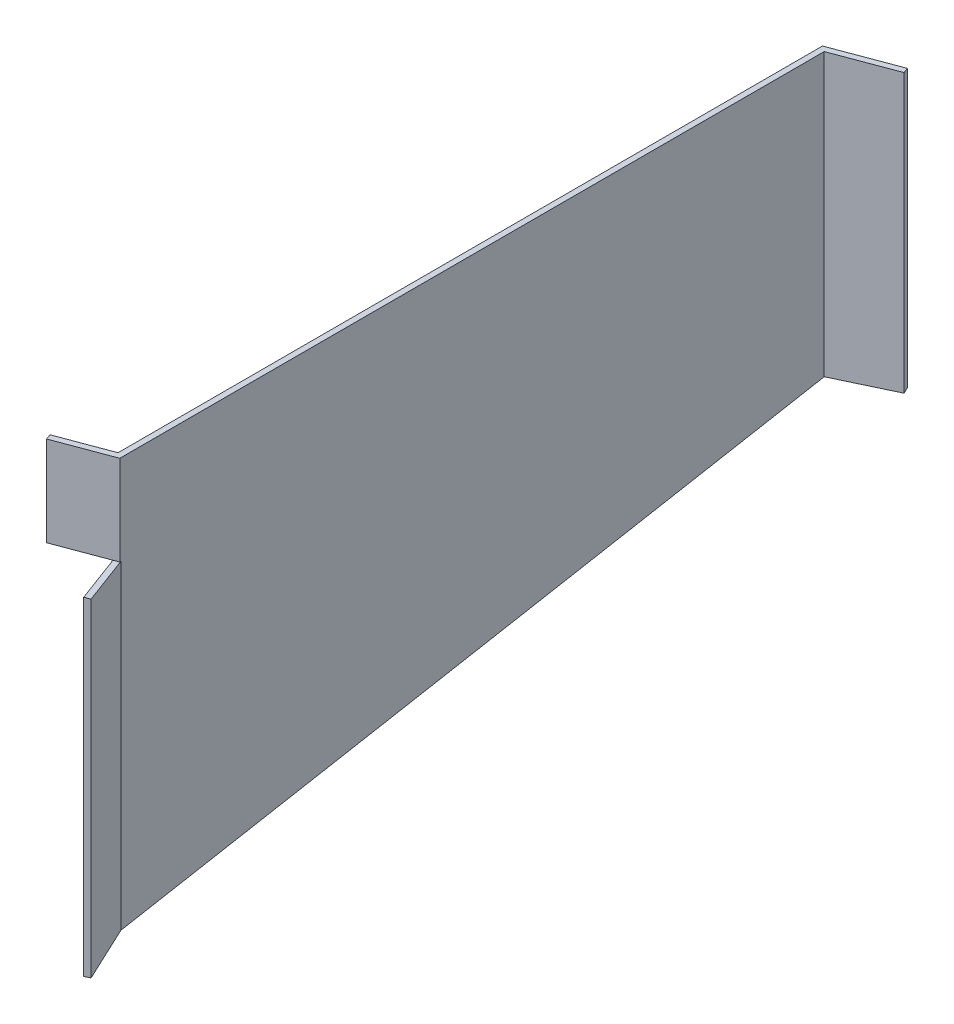
ISO-10303-21;
HEADER;
FILE_DESCRIPTION(('STEP AP214'),'2;1');
FILE_NAME('part.step','',(''),(''),'','','');
FILE_SCHEMA(('AUTOMOTIVE_DESIGN { 1 0 10303 214 1 1 1 1 }'));
ENDSEC;
DATA;
#1=APPLICATION_CONTEXT('core data for automotive mechanical design processes');
#2=APPLICATION_PROTOCOL_DEFINITION('international standard','automotive_design',2000,#1);
#3=PRODUCT_CONTEXT('',#1,'mechanical');
#4=PRODUCT('Part','Part','',(#3));
#5=PRODUCT_RELATED_PRODUCT_CATEGORY('part','',(#4));
#6=PRODUCT_DEFINITION_FORMATION('','',#4);
#7=PRODUCT_DEFINITION_CONTEXT('part definition',#1,'design');
#8=PRODUCT_DEFINITION('design','',#6,#7);
#9=PRODUCT_DEFINITION_SHAPE('','',#8);
#10=(LENGTH_UNIT() NAMED_UNIT(*) SI_UNIT(.MILLI.,.METRE.));
#11=(NAMED_UNIT(*) PLANE_ANGLE_UNIT() SI_UNIT($,.RADIAN.));
#12=(NAMED_UNIT(*) SI_UNIT($,.STERADIAN.) SOLID_ANGLE_UNIT());
#13=UNCERTAINTY_MEASURE_WITH_UNIT(LENGTH_MEASURE(1.E-05),#10,'distance_accuracy_value','');
#14=(GEOMETRIC_REPRESENTATION_CONTEXT(3) GLOBAL_UNCERTAINTY_ASSIGNED_CONTEXT((#13)) GLOBAL_UNIT_ASSIGNED_CONTEXT((#10,
#11,#12)) REPRESENTATION_CONTEXT('',''));
#15=CARTESIAN_POINT('',(0.,0.,0.));
#16=DIRECTION('',(0.,0.,1.));
#17=DIRECTION('',(1.,0.,0.));
#18=AXIS2_PLACEMENT_3D('',#15,#16,#17);
#19=CARTESIAN_POINT('',(0.,178.435,0.));
#20=DIRECTION('',(0.,-1.,0.));
#21=DIRECTION('',(0.,0.,-1.));
#22=AXIS2_PLACEMENT_3D('',#19,#20,#21);
#23=PLANE('',#22);
#24=DIRECTION('',(0.,0.,-1.));
#25=VECTOR('',#24,1.);
#26=CARTESIAN_POINT('',(0.,178.435,0.));
#27=LINE('',#26,#25);
#28=CARTESIAN_POINT('',(0.,178.435,0.));
#29=VERTEX_POINT('',#28);
#30=CARTESIAN_POINT('',(0.,178.435,-2.20339679700141));
#31=VERTEX_POINT('',#30);
#32=EDGE_CURVE('E214',#29,#31,#27,.T.);
#33=ORIENTED_EDGE('',*,*,#32,.F.);
#34=DIRECTION('',(-0.349880399655971,0.,-0.936794377617937));
#35=VECTOR('',#34,1.);
#36=CARTESIAN_POINT('',(0.,178.435,0.));
#37=LINE('',#36,#35);
#38=CARTESIAN_POINT('',(0.388671733651367,178.435,1.04065702217567));
#39=VERTEX_POINT('',#38);
#40=EDGE_CURVE('E164',#39,#29,#37,.T.);
#41=ORIENTED_EDGE('',*,*,#40,.F.);
#42=DIRECTION('',(0.936794377617936,0.,-0.349880399655973));
#43=VECTOR('',#42,1.);
#44=CARTESIAN_POINT('',(3.175,178.435,0.));
#45=LINE('',#44,#43);
#46=CARTESIAN_POINT('',(-26.5682214893695,178.435,11.1087026890771));
#47=VERTEX_POINT('',#46);
#48=EDGE_CURVE('E191',#47,#39,#45,.T.);
#49=ORIENTED_EDGE('',*,*,#48,.F.);
#50=DIRECTION('',(0.349880399655973,0.,0.936794377617936));
#51=VECTOR('',#50,1.);
#52=CARTESIAN_POINT('',(-26.5682214893695,178.435,11.1087026890771));
#53=LINE('',#52,#51);
#54=CARTESIAN_POINT('',(-27.6790917582772,178.435,8.1343805401402));
#55=VERTEX_POINT('',#54);
#56=EDGE_CURVE('E185',#55,#47,#53,.T.);
#57=ORIENTED_EDGE('',*,*,#56,.F.);
#58=DIRECTION('',(-0.936794377617936,0.,0.349880399655973));
#59=VECTOR('',#58,1.);
#60=CARTESIAN_POINT('',(-27.6790917582772,178.435,8.1343805401402));
#61=LINE('',#60,#59);
#62=EDGE_CURVE('E182',#31,#55,#61,.T.);
#63=ORIENTED_EDGE('',*,*,#62,.F.);
#64=EDGE_LOOP('',(#33,#41,#49,#57,#63));
#65=FACE_BOUND('',#64,.T.);
#66=ADVANCED_FACE('F45',(#65),#23,.T.);
#67=CARTESIAN_POINT('',(0.,228.6,0.));
#68=DIRECTION('',(1.,0.,0.));
#69=DIRECTION('',(0.,0.,-1.));
#70=AXIS2_PLACEMENT_3D('',#67,#68,#69);
#71=PLANE('',#70);
#72=ORIENTED_EDGE('',*,*,#32,.T.);
#73=DIRECTION('',(0.,1.,0.));
#74=VECTOR('',#73,1.);
#75=CARTESIAN_POINT('',(0.,228.6,-2.20339679700141));
#76=LINE('',#75,#74);
#77=CARTESIAN_POINT('',(0.,228.6,-2.20339679700139));
#78=VERTEX_POINT('',#77);
#79=EDGE_CURVE('E207',#31,#78,#76,.T.);
#80=ORIENTED_EDGE('',*,*,#79,.T.);
#81=DIRECTION('',(0.,0.,1.));
#82=VECTOR('',#81,1.);
#83=CARTESIAN_POINT('',(0.,228.6,0.));
#84=LINE('',#83,#82);
#85=CARTESIAN_POINT('',(0.,228.6,-395.409928));
#86=VERTEX_POINT('',#85);
#87=EDGE_CURVE('E255',#86,#78,#84,.T.);
#88=ORIENTED_EDGE('',*,*,#87,.F.);
#89=DIRECTION('',(0.,-1.,0.));
#90=VECTOR('',#89,1.);
#91=CARTESIAN_POINT('',(0.,228.6,-395.409928));
#92=LINE('',#91,#90);
#93=CARTESIAN_POINT('',(0.,71.795894,-395.409928));
#94=VERTEX_POINT('',#93);
#95=EDGE_CURVE('E264',#86,#94,#92,.T.);
#96=ORIENTED_EDGE('',*,*,#95,.T.);
#97=DIRECTION('',(0.,-0.178652221619614,0.983912284561168));
#98=VECTOR('',#97,1.);
#99=CARTESIAN_POINT('',(0.,0.,0.));
#100=LINE('',#99,#98);
#101=CARTESIAN_POINT('',(0.,0.,0.));
#102=VERTEX_POINT('',#101);
#103=EDGE_CURVE('E251',#94,#102,#100,.T.);
#104=ORIENTED_EDGE('',*,*,#103,.T.);
#105=DIRECTION('',(0.,-1.,0.));
#106=VECTOR('',#105,1.);
#107=CARTESIAN_POINT('',(0.,228.6,0.));
#108=LINE('',#107,#106);
#109=EDGE_CURVE('E11',#29,#102,#108,.T.);
#110=ORIENTED_EDGE('',*,*,#109,.F.);
#111=EDGE_LOOP('',(#72,#80,#88,#96,#104,#110));
#112=FACE_BOUND('',#111,.T.);
#113=ADVANCED_FACE('F47',(#112),#71,.F.);
#114=CARTESIAN_POINT('',(3.175,228.6,0.));
#115=DIRECTION('',(-1.,0.,0.));
#116=DIRECTION('',(0.,0.,1.));
#117=AXIS2_PLACEMENT_3D('',#114,#115,#116);
#118=PLANE('',#117);
#119=DIRECTION('',(0.,-1.,0.));
#120=VECTOR('',#119,1.);
#121=CARTESIAN_POINT('',(3.175,228.6,0.));
#122=LINE('',#121,#120);
#123=CARTESIAN_POINT('',(3.175,228.6,0.));
#124=VERTEX_POINT('',#123);
#125=CARTESIAN_POINT('',(3.175,178.435,0.));
#126=VERTEX_POINT('',#125);
#127=EDGE_CURVE('E54',#124,#126,#122,.T.);
#128=ORIENTED_EDGE('',*,*,#127,.T.);
#129=DIRECTION('',(0.,0.,-1.));
#130=VECTOR('',#129,1.);
#131=CARTESIAN_POINT('',(3.175,178.435,0.));
#132=LINE('',#131,#130);
#133=CARTESIAN_POINT('',(3.175,178.435,-0.573561283399627));
#134=VERTEX_POINT('',#133);
#135=EDGE_CURVE('E61',#126,#134,#132,.T.);
#136=ORIENTED_EDGE('',*,*,#135,.T.);
#137=DIRECTION('',(0.,1.,0.));
#138=VECTOR('',#137,1.);
#139=CARTESIAN_POINT('',(3.175,228.6,-0.573561283399632));
#140=LINE('',#139,#138);
#141=CARTESIAN_POINT('',(3.175,0.104143427338181,-0.57356128339963));
#142=VERTEX_POINT('',#141);
#143=EDGE_CURVE('E145',#142,#134,#140,.T.);
#144=ORIENTED_EDGE('',*,*,#143,.F.);
#145=DIRECTION('',(0.,-0.178652221619614,0.983912284561168));
#146=VECTOR('',#145,1.);
#147=CARTESIAN_POINT('',(3.175,0.,0.));
#148=LINE('',#147,#146);
#149=CARTESIAN_POINT('',(3.17500000000006,71.3958159248803,-393.206531202999));
#150=VERTEX_POINT('',#149);
#151=EDGE_CURVE('E250',#150,#142,#148,.T.);
#152=ORIENTED_EDGE('',*,*,#151,.F.);
#153=DIRECTION('',(0.,1.,0.));
#154=VECTOR('',#153,1.);
#155=CARTESIAN_POINT('',(3.17499999999993,228.6,-393.206531202999));
#156=LINE('',#155,#154);
#157=CARTESIAN_POINT('',(3.17500000000002,228.6,-393.206531202999));
#158=VERTEX_POINT('',#157);
#159=EDGE_CURVE('E246',#150,#158,#156,.T.);
#160=ORIENTED_EDGE('',*,*,#159,.T.);
#161=DIRECTION('',(0.,0.,-1.));
#162=VECTOR('',#161,1.);
#163=CARTESIAN_POINT('',(3.175,228.6,0.));
#164=LINE('',#163,#162);
#165=EDGE_CURVE('E69',#124,#158,#164,.T.);
#166=ORIENTED_EDGE('',*,*,#165,.F.);
#167=EDGE_LOOP('',(#128,#136,#144,#152,#160,#166));
#168=FACE_BOUND('',#167,.T.);
#169=ADVANCED_FACE('F270',(#168),#118,.F.);
#170=CARTESIAN_POINT('',(0.,228.6,0.));
#171=DIRECTION('',(0.,-1.,0.));
#172=DIRECTION('',(0.,0.,-1.));
#173=AXIS2_PLACEMENT_3D('',#170,#171,#172);
#174=PLANE('',#173);
#175=ORIENTED_EDGE('',*,*,#87,.T.);
#176=DIRECTION('',(-0.936794377617936,0.,0.349880399655973));
#177=VECTOR('',#176,1.);
#178=CARTESIAN_POINT('',(-27.6790917582772,228.6,8.1343805401402));
#179=LINE('',#178,#177);
#180=CARTESIAN_POINT('',(-27.6790917582772,228.6,8.1343805401402));
#181=VERTEX_POINT('',#180);
#182=EDGE_CURVE('E181',#78,#181,#179,.T.);
#183=ORIENTED_EDGE('',*,*,#182,.T.);
#184=DIRECTION('',(0.349880399655973,0.,0.936794377617936));
#185=VECTOR('',#184,1.);
#186=CARTESIAN_POINT('',(-26.5682214893695,228.6,11.1087026890771));
#187=LINE('',#186,#185);
#188=CARTESIAN_POINT('',(-26.5682214893695,228.6,11.1087026890771));
#189=VERTEX_POINT('',#188);
#190=EDGE_CURVE('E198',#181,#189,#187,.T.);
#191=ORIENTED_EDGE('',*,*,#190,.T.);
#192=DIRECTION('',(0.936794377617936,0.,-0.349880399655973));
#193=VECTOR('',#192,1.);
#194=CARTESIAN_POINT('',(3.175,228.6,0.));
#195=LINE('',#194,#193);
#196=EDGE_CURVE('E186',#189,#124,#195,.T.);
#197=ORIENTED_EDGE('',*,*,#196,.T.);
#198=ORIENTED_EDGE('',*,*,#165,.T.);
#199=DIRECTION('',(0.936794377617936,0.,-0.349880399655974));
#200=VECTOR('',#199,1.);
#201=CARTESIAN_POINT('',(35.6130071965762,228.6,-405.321700970393));
#202=LINE('',#201,#200);
#203=CARTESIAN_POINT('',(35.6130071965762,228.6,-405.321700970393));
#204=VERTEX_POINT('',#203);
#205=EDGE_CURVE('E218',#158,#204,#202,.T.);
#206=ORIENTED_EDGE('',*,*,#205,.T.);
#207=DIRECTION('',(-0.34988039965597,0.,-0.936794377617938));
#208=VECTOR('',#207,1.);
#209=CARTESIAN_POINT('',(34.5021369276685,228.6,-408.29602311933));
#210=LINE('',#209,#208);
#211=CARTESIAN_POINT('',(34.5021369276685,228.6,-408.29602311933));
#212=VERTEX_POINT('',#211);
#213=EDGE_CURVE('E229',#204,#212,#210,.T.);
#214=ORIENTED_EDGE('',*,*,#213,.T.);
#215=DIRECTION('',(-0.936794377617936,0.,0.349880399655973));
#216=VECTOR('',#215,1.);
#217=CARTESIAN_POINT('',(0.,228.6,-395.409928));
#218=LINE('',#217,#216);
#219=EDGE_CURVE('E233',#212,#86,#218,.T.);
#220=ORIENTED_EDGE('',*,*,#219,.T.);
#221=EDGE_LOOP('',(#175,#183,#191,#197,#198,#206,#214,#220));
#222=FACE_BOUND('',#221,.T.);
#223=ADVANCED_FACE('F274',(#222),#174,.F.);
#224=CARTESIAN_POINT('',(0.,0.,0.));
#225=DIRECTION('',(0.,0.983912284561168,0.178652221619614));
#226=DIRECTION('',(0.,-0.178652221619614,0.983912284561168));
#227=AXIS2_PLACEMENT_3D('',#224,#225,#226);
#228=PLANE('',#227);
#229=ORIENTED_EDGE('',*,*,#151,.T.);
#230=DIRECTION('',(-0.34492611563089,0.167688306024815,-0.923529429297363));
#231=VECTOR('',#230,1.);
#232=CARTESIAN_POINT('',(14.8846886705718,-5.58860573911633,30.7787823203981));
#233=LINE('',#232,#231);
#234=CARTESIAN_POINT('',(13.0808317279512,-4.71164774344272,25.9490089363056));
#235=VERTEX_POINT('',#234);
#236=EDGE_CURVE('E178',#235,#142,#233,.T.);
#237=ORIENTED_EDGE('',*,*,#236,.F.);
#238=DIRECTION('',(0.934909663758706,0.063401133965717,-0.349176483776392));
#239=VECTOR('',#238,1.);
#240=CARTESIAN_POINT('',(8.269878400868,-5.03790375321259,27.745836834746));
#241=LINE('',#240,#239);
#242=CARTESIAN_POINT('',(10.1065095790142,-4.91335214797716,27.0598792052133));
#243=VERTEX_POINT('',#242);
#244=EDGE_CURVE('E155',#243,#235,#241,.T.);
#245=ORIENTED_EDGE('',*,*,#244,.F.);
#246=DIRECTION('',(0.344926115630891,-0.167688306024815,0.923529429297363));
#247=VECTOR('',#246,1.);
#248=CARTESIAN_POINT('',(2.07637900634612,-1.00944655235171,5.55944311502323));
#249=LINE('',#248,#247);
#250=EDGE_CURVE('E157',#102,#243,#249,.T.);
#251=ORIENTED_EDGE('',*,*,#250,.F.);
#252=ORIENTED_EDGE('',*,*,#103,.F.);
#253=DIRECTION('',(0.934909663758705,0.0634011339657175,-0.349176483776394));
#254=VECTOR('',#253,1.);
#255=CARTESIAN_POINT('',(-2.28879921481923,71.6406785056431,-394.555091545869));
#256=LINE('',#255,#254);
#257=CARTESIAN_POINT('',(34.5021369276685,74.1356650925996,-408.29602311933));
#258=VERTEX_POINT('',#257);
#259=EDGE_CURVE('E222',#94,#258,#256,.T.);
#260=ORIENTED_EDGE('',*,*,#259,.T.);
#261=DIRECTION('',(0.344926115630889,-0.167688306024815,0.923529429297364));
#262=VECTOR('',#261,1.);
#263=CARTESIAN_POINT('',(36.8708867690326,72.9840803609872,-401.953765777806));
#264=LINE('',#263,#262);
#265=CARTESIAN_POINT('',(35.6130071965762,73.5956075406635,-405.321700970393));
#266=VERTEX_POINT('',#265);
#267=EDGE_CURVE('E219',#258,#266,#264,.T.);
#268=ORIENTED_EDGE('',*,*,#267,.T.);
#269=DIRECTION('',(-0.934909663758704,-0.0634011339657177,0.349176483776395));
#270=VECTOR('',#269,1.);
#271=CARTESIAN_POINT('',(33.2175311623351,73.4331577309696,-404.427022124905));
#272=LINE('',#271,#270);
#273=EDGE_CURVE('E226',#266,#150,#272,.T.);
#274=ORIENTED_EDGE('',*,*,#273,.T.);
#275=EDGE_LOOP('',(#229,#237,#245,#251,#252,#260,#268,#274));
#276=FACE_BOUND('',#275,.T.);
#277=ADVANCED_FACE('F290',(#276),#228,.F.);
#278=CARTESIAN_POINT('',(35.6130071965762,33.1822292780044,-405.321700970393));
#279=DIRECTION('',(0.349880399655974,0.,0.936794377617936));
#280=DIRECTION('',(0.936794377617936,0.,-0.349880399655974));
#281=AXIS2_PLACEMENT_3D('',#278,#279,#280);
#282=PLANE('',#281);
#283=ORIENTED_EDGE('',*,*,#159,.F.);
#284=ORIENTED_EDGE('',*,*,#273,.F.);
#285=DIRECTION('',(0.,1.,0.));
#286=VECTOR('',#285,1.);
#287=CARTESIAN_POINT('',(35.6130071965762,33.1822292780044,-405.321700970393));
#288=LINE('',#287,#286);
#289=EDGE_CURVE('E237',#266,#204,#288,.T.);
#290=ORIENTED_EDGE('',*,*,#289,.T.);
#291=ORIENTED_EDGE('',*,*,#205,.F.);
#292=EDGE_LOOP('',(#283,#284,#290,#291));
#293=FACE_BOUND('',#292,.T.);
#294=ADVANCED_FACE('F299',(#293),#282,.T.);
#295=CARTESIAN_POINT('',(0.,33.1822292780044,-395.409928));
#296=DIRECTION('',(-0.349880399655973,0.,-0.936794377617936));
#297=DIRECTION('',(-0.936794377617936,0.,0.349880399655973));
#298=AXIS2_PLACEMENT_3D('',#295,#296,#297);
#299=PLANE('',#298);
#300=ORIENTED_EDGE('',*,*,#259,.F.);
#301=ORIENTED_EDGE('',*,*,#95,.F.);
#302=ORIENTED_EDGE('',*,*,#219,.F.);
#303=DIRECTION('',(0.,1.,0.));
#304=VECTOR('',#303,1.);
#305=CARTESIAN_POINT('',(34.5021369276685,33.1822292780044,-408.29602311933));
#306=LINE('',#305,#304);
#307=EDGE_CURVE('E223',#258,#212,#306,.T.);
#308=ORIENTED_EDGE('',*,*,#307,.F.);
#309=EDGE_LOOP('',(#300,#301,#302,#308));
#310=FACE_BOUND('',#309,.T.);
#311=ADVANCED_FACE('F306',(#310),#299,.T.);
#312=CARTESIAN_POINT('',(34.5021369276685,33.1822292780044,-408.29602311933));
#313=DIRECTION('',(0.936794377617938,0.,-0.34988039965597));
#314=DIRECTION('',(-0.34988039965597,0.,-0.936794377617938));
#315=AXIS2_PLACEMENT_3D('',#312,#313,#314);
#316=PLANE('',#315);
#317=ORIENTED_EDGE('',*,*,#267,.F.);
#318=ORIENTED_EDGE('',*,*,#307,.T.);
#319=ORIENTED_EDGE('',*,*,#213,.F.);
#320=ORIENTED_EDGE('',*,*,#289,.F.);
#321=EDGE_LOOP('',(#317,#318,#319,#320));
#322=FACE_BOUND('',#321,.T.);
#323=ADVANCED_FACE('F311',(#322),#316,.T.);
#324=CARTESIAN_POINT('',(-27.6790917582772,178.435,8.1343805401402));
#325=DIRECTION('',(-0.349880399655973,0.,-0.936794377617936));
#326=DIRECTION('',(-0.936794377617936,0.,0.349880399655973));
#327=AXIS2_PLACEMENT_3D('',#324,#325,#326);
#328=PLANE('',#327);
#329=ORIENTED_EDGE('',*,*,#79,.F.);
#330=ORIENTED_EDGE('',*,*,#62,.T.);
#331=DIRECTION('',(0.,1.,0.));
#332=VECTOR('',#331,1.);
#333=CARTESIAN_POINT('',(-27.6790917582772,178.435,8.1343805401402));
#334=LINE('',#333,#332);
#335=EDGE_CURVE('E195',#55,#181,#334,.T.);
#336=ORIENTED_EDGE('',*,*,#335,.T.);
#337=ORIENTED_EDGE('',*,*,#182,.F.);
#338=EDGE_LOOP('',(#329,#330,#336,#337));
#339=FACE_BOUND('',#338,.T.);
#340=ADVANCED_FACE('F309',(#339),#328,.T.);
#341=CARTESIAN_POINT('',(3.175,178.435,0.));
#342=DIRECTION('',(0.349880399655973,0.,0.936794377617936));
#343=DIRECTION('',(0.936794377617936,0.,-0.349880399655973));
#344=AXIS2_PLACEMENT_3D('',#341,#342,#343);
#345=PLANE('',#344);
#346=ORIENTED_EDGE('',*,*,#196,.F.);
#347=DIRECTION('',(0.,1.,0.));
#348=VECTOR('',#347,1.);
#349=CARTESIAN_POINT('',(-26.5682214893695,178.435,11.1087026890771));
#350=LINE('',#349,#348);
#351=EDGE_CURVE('E204',#47,#189,#350,.T.);
#352=ORIENTED_EDGE('',*,*,#351,.F.);
#353=ORIENTED_EDGE('',*,*,#48,.T.);
#354=EDGE_CURVE('E190',#39,#126,#45,.T.);
#355=ORIENTED_EDGE('',*,*,#354,.T.);
#356=ORIENTED_EDGE('',*,*,#127,.F.);
#357=EDGE_LOOP('',(#346,#352,#353,#355,#356));
#358=FACE_BOUND('',#357,.T.);
#359=ADVANCED_FACE('F273',(#358),#345,.T.);
#360=CARTESIAN_POINT('',(-26.5682214893695,178.435,11.1087026890771));
#361=DIRECTION('',(-0.936794377617936,0.,0.349880399655973));
#362=DIRECTION('',(0.349880399655973,0.,0.936794377617936));
#363=AXIS2_PLACEMENT_3D('',#360,#361,#362);
#364=PLANE('',#363);
#365=ORIENTED_EDGE('',*,*,#190,.F.);
#366=ORIENTED_EDGE('',*,*,#335,.F.);
#367=ORIENTED_EDGE('',*,*,#56,.T.);
#368=ORIENTED_EDGE('',*,*,#351,.T.);
#369=EDGE_LOOP('',(#365,#366,#367,#368));
#370=FACE_BOUND('',#369,.T.);
#371=ADVANCED_FACE('F278',(#370),#364,.T.);
#372=CARTESIAN_POINT('',(13.0808317279512,-35.89862166036,25.9490089363056));
#373=DIRECTION('',(-0.936794377617937,0.,0.349880399655971));
#374=DIRECTION('',(0.349880399655971,0.,0.936794377617937));
#375=AXIS2_PLACEMENT_3D('',#372,#373,#374);
#376=PLANE('',#375);
#377=ORIENTED_EDGE('',*,*,#236,.T.);
#378=ORIENTED_EDGE('',*,*,#143,.T.);
#379=DIRECTION('',(0.349880399655971,0.,0.936794377617937));
#380=VECTOR('',#379,1.);
#381=CARTESIAN_POINT('',(13.0808317279512,178.435,25.9490089363056));
#382=LINE('',#381,#380);
#383=CARTESIAN_POINT('',(13.0808317279512,178.435,25.9490089363056));
#384=VERTEX_POINT('',#383);
#385=EDGE_CURVE('E139',#134,#384,#382,.T.);
#386=ORIENTED_EDGE('',*,*,#385,.T.);
#387=DIRECTION('',(0.,1.,0.));
#388=VECTOR('',#387,1.);
#389=CARTESIAN_POINT('',(13.0808317279512,-35.89862166036,25.9490089363056));
#390=LINE('',#389,#388);
#391=EDGE_CURVE('E142',#235,#384,#390,.T.);
#392=ORIENTED_EDGE('',*,*,#391,.F.);
#393=EDGE_LOOP('',(#377,#378,#386,#392));
#394=FACE_BOUND('',#393,.T.);
#395=ADVANCED_FACE('F141',(#394),#376,.F.);
#396=CARTESIAN_POINT('',(0.,178.435,0.));
#397=DIRECTION('',(0.,1.,0.));
#398=DIRECTION('',(0.,0.,1.));
#399=AXIS2_PLACEMENT_3D('',#396,#397,#398);
#400=PLANE('',#399);
#401=ORIENTED_EDGE('',*,*,#135,.F.);
#402=ORIENTED_EDGE('',*,*,#354,.F.);
#403=CARTESIAN_POINT('',(10.1065095790142,178.435,27.0598792052133));
#404=VERTEX_POINT('',#403);
#405=EDGE_CURVE('E162',#404,#39,#37,.T.);
#406=ORIENTED_EDGE('',*,*,#405,.F.);
#407=DIRECTION('',(-0.936794377617937,0.,0.34988039965597));
#408=VECTOR('',#407,1.);
#409=CARTESIAN_POINT('',(10.1065095790142,178.435,27.0598792052133));
#410=LINE('',#409,#408);
#411=EDGE_CURVE('E148',#384,#404,#410,.T.);
#412=ORIENTED_EDGE('',*,*,#411,.F.);
#413=ORIENTED_EDGE('',*,*,#385,.F.);
#414=EDGE_LOOP('',(#401,#402,#406,#412,#413));
#415=FACE_BOUND('',#414,.T.);
#416=ADVANCED_FACE('F160',(#415),#400,.T.);
#417=CARTESIAN_POINT('',(0.,-35.89862166036,0.));
#418=DIRECTION('',(0.936794377617937,0.,-0.349880399655971));
#419=DIRECTION('',(-0.349880399655971,0.,-0.936794377617937));
#420=AXIS2_PLACEMENT_3D('',#417,#418,#419);
#421=PLANE('',#420);
#422=ORIENTED_EDGE('',*,*,#109,.T.);
#423=ORIENTED_EDGE('',*,*,#250,.T.);
#424=DIRECTION('',(0.,1.,0.));
#425=VECTOR('',#424,1.);
#426=CARTESIAN_POINT('',(10.1065095790142,-35.89862166036,27.0598792052133));
#427=LINE('',#426,#425);
#428=EDGE_CURVE('E158',#243,#404,#427,.T.);
#429=ORIENTED_EDGE('',*,*,#428,.T.);
#430=ORIENTED_EDGE('',*,*,#405,.T.);
#431=ORIENTED_EDGE('',*,*,#40,.T.);
#432=EDGE_LOOP('',(#422,#423,#429,#430,#431));
#433=FACE_BOUND('',#432,.T.);
#434=ADVANCED_FACE('F287',(#433),#421,.F.);
#435=CARTESIAN_POINT('',(10.1065095790142,-35.89862166036,27.0598792052133));
#436=DIRECTION('',(-0.34988039965597,0.,-0.936794377617937));
#437=DIRECTION('',(-0.936794377617937,0.,0.34988039965597));
#438=AXIS2_PLACEMENT_3D('',#435,#436,#437);
#439=PLANE('',#438);
#440=ORIENTED_EDGE('',*,*,#428,.F.);
#441=ORIENTED_EDGE('',*,*,#244,.T.);
#442=ORIENTED_EDGE('',*,*,#391,.T.);
#443=ORIENTED_EDGE('',*,*,#411,.T.);
#444=EDGE_LOOP('',(#440,#441,#442,#443));
#445=FACE_BOUND('',#444,.T.);
#446=ADVANCED_FACE('F153',(#445),#439,.F.);
#447=CLOSED_SHELL('',(#66,#113,#169,#223,#277,#294,#311,#323,#340,#359,#371,#395,#416,#434,#446));
#448=MANIFOLD_SOLID_BREP('B2',#447);
#449=ADVANCED_BREP_SHAPE_REPRESENTATION('',(#18,#448),#14);
#450=SHAPE_DEFINITION_REPRESENTATION(#9,#449);
ENDSEC;
END-ISO-10303-21;
